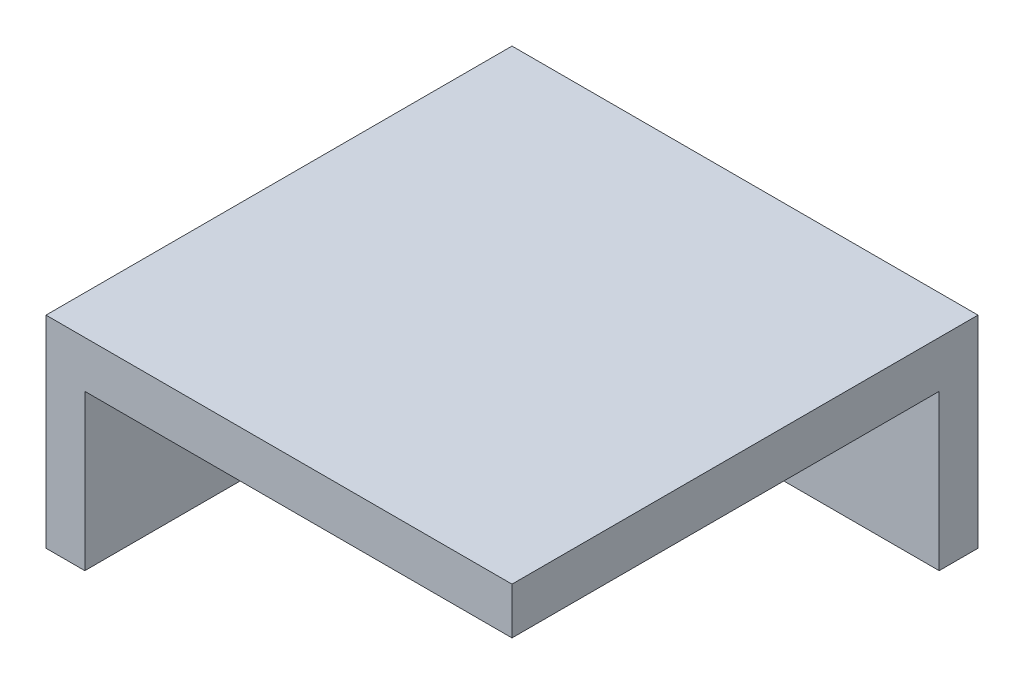
ISO-10303-21;
HEADER;
FILE_DESCRIPTION(('STEP AP214'),'2;1');
FILE_NAME('part.step','',(''),(''),'','','');
FILE_SCHEMA(('AUTOMOTIVE_DESIGN { 1 0 10303 214 1 1 1 1 }'));
ENDSEC;
DATA;
#1=APPLICATION_CONTEXT('core data for automotive mechanical design processes');
#2=APPLICATION_PROTOCOL_DEFINITION('international standard','automotive_design',2000,#1);
#3=PRODUCT_CONTEXT('',#1,'mechanical');
#4=PRODUCT('Part','Part','',(#3));
#5=PRODUCT_RELATED_PRODUCT_CATEGORY('part','',(#4));
#6=PRODUCT_DEFINITION_FORMATION('','',#4);
#7=PRODUCT_DEFINITION_CONTEXT('part definition',#1,'design');
#8=PRODUCT_DEFINITION('design','',#6,#7);
#9=PRODUCT_DEFINITION_SHAPE('','',#8);
#10=(LENGTH_UNIT() NAMED_UNIT(*) SI_UNIT(.MILLI.,.METRE.));
#11=(NAMED_UNIT(*) PLANE_ANGLE_UNIT() SI_UNIT($,.RADIAN.));
#12=(NAMED_UNIT(*) SI_UNIT($,.STERADIAN.) SOLID_ANGLE_UNIT());
#13=UNCERTAINTY_MEASURE_WITH_UNIT(LENGTH_MEASURE(1.E-05),#10,'distance_accuracy_value','');
#14=(GEOMETRIC_REPRESENTATION_CONTEXT(3) GLOBAL_UNCERTAINTY_ASSIGNED_CONTEXT((#13)) GLOBAL_UNIT_ASSIGNED_CONTEXT((#10,
#11,#12)) REPRESENTATION_CONTEXT('',''));
#15=CARTESIAN_POINT('',(0.,0.,0.));
#16=DIRECTION('',(0.,0.,1.));
#17=DIRECTION('',(1.,0.,0.));
#18=AXIS2_PLACEMENT_3D('',#15,#16,#17);
#19=CARTESIAN_POINT('',(30.,6.,30.));
#20=DIRECTION('',(-1.,0.,0.));
#21=DIRECTION('',(0.,0.,1.));
#22=AXIS2_PLACEMENT_3D('',#19,#20,#21);
#23=PLANE('',#22);
#24=DIRECTION('',(0.,0.,-1.));
#25=VECTOR('',#24,1.);
#26=CARTESIAN_POINT('',(30.,0.,30.));
#27=LINE('',#26,#25);
#28=CARTESIAN_POINT('',(30.,0.,30.));
#29=VERTEX_POINT('',#28);
#30=CARTESIAN_POINT('',(30.,0.,-25.));
#31=VERTEX_POINT('',#30);
#32=EDGE_CURVE('E111',#29,#31,#27,.T.);
#33=ORIENTED_EDGE('',*,*,#32,.T.);
#34=DIRECTION('',(0.,1.,0.));
#35=VECTOR('',#34,1.);
#36=CARTESIAN_POINT('',(30.,-20.,-25.));
#37=LINE('',#36,#35);
#38=CARTESIAN_POINT('',(30.,-20.,-25.));
#39=VERTEX_POINT('',#38);
#40=EDGE_CURVE('E47',#39,#31,#37,.T.);
#41=ORIENTED_EDGE('',*,*,#40,.F.);
#42=DIRECTION('',(0.,0.,-1.));
#43=VECTOR('',#42,1.);
#44=CARTESIAN_POINT('',(30.,-20.,-30.));
#45=LINE('',#44,#43);
#46=CARTESIAN_POINT('',(30.,-20.,-30.));
#47=VERTEX_POINT('',#46);
#48=EDGE_CURVE('E138',#39,#47,#45,.T.);
#49=ORIENTED_EDGE('',*,*,#48,.T.);
#50=DIRECTION('',(0.,-1.,0.));
#51=VECTOR('',#50,1.);
#52=CARTESIAN_POINT('',(30.,6.,-30.));
#53=LINE('',#52,#51);
#54=CARTESIAN_POINT('',(30.,6.,-30.));
#55=VERTEX_POINT('',#54);
#56=EDGE_CURVE('E11',#55,#47,#53,.T.);
#57=ORIENTED_EDGE('',*,*,#56,.F.);
#58=DIRECTION('',(0.,0.,-1.));
#59=VECTOR('',#58,1.);
#60=CARTESIAN_POINT('',(30.,6.,30.));
#61=LINE('',#60,#59);
#62=CARTESIAN_POINT('',(30.,6.,30.));
#63=VERTEX_POINT('',#62);
#64=EDGE_CURVE('E95',#63,#55,#61,.T.);
#65=ORIENTED_EDGE('',*,*,#64,.F.);
#66=DIRECTION('',(0.,-1.,0.));
#67=VECTOR('',#66,1.);
#68=CARTESIAN_POINT('',(30.,6.,30.));
#69=LINE('',#68,#67);
#70=EDGE_CURVE('E107',#63,#29,#69,.T.);
#71=ORIENTED_EDGE('',*,*,#70,.T.);
#72=EDGE_LOOP('',(#33,#41,#49,#57,#65,#71));
#73=FACE_BOUND('',#72,.T.);
#74=ADVANCED_FACE('F33',(#73),#23,.F.);
#75=CARTESIAN_POINT('',(30.,6.,-30.));
#76=DIRECTION('',(0.,0.,1.));
#77=DIRECTION('',(1.,0.,0.));
#78=AXIS2_PLACEMENT_3D('',#75,#76,#77);
#79=PLANE('',#78);
#80=ORIENTED_EDGE('',*,*,#56,.T.);
#81=DIRECTION('',(-1.,0.,0.));
#82=VECTOR('',#81,1.);
#83=CARTESIAN_POINT('',(-30.,-20.,-30.));
#84=LINE('',#83,#82);
#85=CARTESIAN_POINT('',(-30.,-20.,-30.));
#86=VERTEX_POINT('',#85);
#87=EDGE_CURVE('E99',#47,#86,#84,.T.);
#88=ORIENTED_EDGE('',*,*,#87,.T.);
#89=DIRECTION('',(0.,-1.,0.));
#90=VECTOR('',#89,1.);
#91=CARTESIAN_POINT('',(-30.,6.,-30.));
#92=LINE('',#91,#90);
#93=CARTESIAN_POINT('',(-30.,6.,-30.));
#94=VERTEX_POINT('',#93);
#95=EDGE_CURVE('E40',#94,#86,#92,.T.);
#96=ORIENTED_EDGE('',*,*,#95,.F.);
#97=DIRECTION('',(-1.,0.,0.));
#98=VECTOR('',#97,1.);
#99=CARTESIAN_POINT('',(30.,6.,-30.));
#100=LINE('',#99,#98);
#101=EDGE_CURVE('E88',#55,#94,#100,.T.);
#102=ORIENTED_EDGE('',*,*,#101,.F.);
#103=EDGE_LOOP('',(#80,#88,#96,#102));
#104=FACE_BOUND('',#103,.T.);
#105=ADVANCED_FACE('F98',(#104),#79,.F.);
#106=CARTESIAN_POINT('',(-30.,6.,-30.));
#107=DIRECTION('',(1.,0.,0.));
#108=DIRECTION('',(0.,0.,-1.));
#109=AXIS2_PLACEMENT_3D('',#106,#107,#108);
#110=PLANE('',#109);
#111=ORIENTED_EDGE('',*,*,#95,.T.);
#112=DIRECTION('',(0.,0.,1.));
#113=VECTOR('',#112,1.);
#114=CARTESIAN_POINT('',(-30.,-20.,-30.));
#115=LINE('',#114,#113);
#116=CARTESIAN_POINT('',(-30.,-20.,30.));
#117=VERTEX_POINT('',#116);
#118=EDGE_CURVE('E126',#86,#117,#115,.T.);
#119=ORIENTED_EDGE('',*,*,#118,.T.);
#120=DIRECTION('',(0.,-1.,0.));
#121=VECTOR('',#120,1.);
#122=CARTESIAN_POINT('',(-30.,6.,30.));
#123=LINE('',#122,#121);
#124=CARTESIAN_POINT('',(-30.,6.,30.));
#125=VERTEX_POINT('',#124);
#126=EDGE_CURVE('E103',#125,#117,#123,.T.);
#127=ORIENTED_EDGE('',*,*,#126,.F.);
#128=DIRECTION('',(0.,0.,1.));
#129=VECTOR('',#128,1.);
#130=CARTESIAN_POINT('',(-30.,6.,-30.));
#131=LINE('',#130,#129);
#132=EDGE_CURVE('E92',#94,#125,#131,.T.);
#133=ORIENTED_EDGE('',*,*,#132,.F.);
#134=EDGE_LOOP('',(#111,#119,#127,#133));
#135=FACE_BOUND('',#134,.T.);
#136=ADVANCED_FACE('F104',(#135),#110,.F.);
#137=CARTESIAN_POINT('',(-30.,6.,30.));
#138=DIRECTION('',(0.,0.,-1.));
#139=DIRECTION('',(-1.,0.,0.));
#140=AXIS2_PLACEMENT_3D('',#137,#138,#139);
#141=PLANE('',#140);
#142=ORIENTED_EDGE('',*,*,#126,.T.);
#143=DIRECTION('',(1.,0.,0.));
#144=VECTOR('',#143,1.);
#145=CARTESIAN_POINT('',(-30.,-20.,30.));
#146=LINE('',#145,#144);
#147=CARTESIAN_POINT('',(-25.,-20.,30.));
#148=VERTEX_POINT('',#147);
#149=EDGE_CURVE('E121',#117,#148,#146,.T.);
#150=ORIENTED_EDGE('',*,*,#149,.T.);
#151=DIRECTION('',(0.,1.,0.));
#152=VECTOR('',#151,1.);
#153=CARTESIAN_POINT('',(-25.,-20.,30.));
#154=LINE('',#153,#152);
#155=CARTESIAN_POINT('',(-25.,0.,30.));
#156=VERTEX_POINT('',#155);
#157=EDGE_CURVE('E141',#148,#156,#154,.T.);
#158=ORIENTED_EDGE('',*,*,#157,.T.);
#159=DIRECTION('',(1.,0.,0.));
#160=VECTOR('',#159,1.);
#161=CARTESIAN_POINT('',(-30.,0.,30.));
#162=LINE('',#161,#160);
#163=EDGE_CURVE('E68',#156,#29,#162,.T.);
#164=ORIENTED_EDGE('',*,*,#163,.T.);
#165=ORIENTED_EDGE('',*,*,#70,.F.);
#166=DIRECTION('',(1.,0.,0.));
#167=VECTOR('',#166,1.);
#168=CARTESIAN_POINT('',(-30.,6.,30.));
#169=LINE('',#168,#167);
#170=EDGE_CURVE('E56',#125,#63,#169,.T.);
#171=ORIENTED_EDGE('',*,*,#170,.F.);
#172=EDGE_LOOP('',(#142,#150,#158,#164,#165,#171));
#173=FACE_BOUND('',#172,.T.);
#174=ADVANCED_FACE('F119',(#173),#141,.F.);
#175=CARTESIAN_POINT('',(0.,6.,0.));
#176=DIRECTION('',(0.,1.,0.));
#177=DIRECTION('',(0.,0.,1.));
#178=AXIS2_PLACEMENT_3D('',#175,#176,#177);
#179=PLANE('',#178);
#180=ORIENTED_EDGE('',*,*,#64,.T.);
#181=ORIENTED_EDGE('',*,*,#101,.T.);
#182=ORIENTED_EDGE('',*,*,#132,.T.);
#183=ORIENTED_EDGE('',*,*,#170,.T.);
#184=EDGE_LOOP('',(#180,#181,#182,#183));
#185=FACE_BOUND('',#184,.T.);
#186=ADVANCED_FACE('F90',(#185),#179,.T.);
#187=CARTESIAN_POINT('',(0.,0.,0.));
#188=DIRECTION('',(0.,1.,0.));
#189=DIRECTION('',(0.,0.,1.));
#190=AXIS2_PLACEMENT_3D('',#187,#188,#189);
#191=PLANE('',#190);
#192=ORIENTED_EDGE('',*,*,#163,.F.);
#193=DIRECTION('',(0.,0.,-1.));
#194=VECTOR('',#193,1.);
#195=CARTESIAN_POINT('',(-25.,0.,-25.));
#196=LINE('',#195,#194);
#197=CARTESIAN_POINT('',(-25.,0.,-25.));
#198=VERTEX_POINT('',#197);
#199=EDGE_CURVE('E142',#156,#198,#196,.T.);
#200=ORIENTED_EDGE('',*,*,#199,.T.);
#201=DIRECTION('',(1.,0.,0.));
#202=VECTOR('',#201,1.);
#203=CARTESIAN_POINT('',(-25.,0.,-25.));
#204=LINE('',#203,#202);
#205=EDGE_CURVE('E132',#198,#31,#204,.T.);
#206=ORIENTED_EDGE('',*,*,#205,.T.);
#207=ORIENTED_EDGE('',*,*,#32,.F.);
#208=EDGE_LOOP('',(#192,#200,#206,#207));
#209=FACE_BOUND('',#208,.T.);
#210=ADVANCED_FACE('F156',(#209),#191,.F.);
#211=CARTESIAN_POINT('',(-25.,-20.,-25.));
#212=DIRECTION('',(0.,0.,1.));
#213=DIRECTION('',(1.,0.,0.));
#214=AXIS2_PLACEMENT_3D('',#211,#212,#213);
#215=PLANE('',#214);
#216=ORIENTED_EDGE('',*,*,#205,.F.);
#217=DIRECTION('',(0.,1.,0.));
#218=VECTOR('',#217,1.);
#219=CARTESIAN_POINT('',(-25.,-20.,-25.));
#220=LINE('',#219,#218);
#221=CARTESIAN_POINT('',(-25.,-20.,-25.));
#222=VERTEX_POINT('',#221);
#223=EDGE_CURVE('E147',#222,#198,#220,.T.);
#224=ORIENTED_EDGE('',*,*,#223,.F.);
#225=DIRECTION('',(1.,0.,0.));
#226=VECTOR('',#225,1.);
#227=CARTESIAN_POINT('',(-25.,-20.,-25.));
#228=LINE('',#227,#226);
#229=EDGE_CURVE('E136',#222,#39,#228,.T.);
#230=ORIENTED_EDGE('',*,*,#229,.T.);
#231=ORIENTED_EDGE('',*,*,#40,.T.);
#232=EDGE_LOOP('',(#216,#224,#230,#231));
#233=FACE_BOUND('',#232,.T.);
#234=ADVANCED_FACE('F159',(#233),#215,.T.);
#235=CARTESIAN_POINT('',(-25.,-20.,-25.));
#236=DIRECTION('',(1.,0.,0.));
#237=DIRECTION('',(0.,0.,-1.));
#238=AXIS2_PLACEMENT_3D('',#235,#236,#237);
#239=PLANE('',#238);
#240=ORIENTED_EDGE('',*,*,#199,.F.);
#241=ORIENTED_EDGE('',*,*,#157,.F.);
#242=DIRECTION('',(0.,0.,-1.));
#243=VECTOR('',#242,1.);
#244=CARTESIAN_POINT('',(-25.,-20.,-25.));
#245=LINE('',#244,#243);
#246=EDGE_CURVE('E129',#148,#222,#245,.T.);
#247=ORIENTED_EDGE('',*,*,#246,.T.);
#248=ORIENTED_EDGE('',*,*,#223,.T.);
#249=EDGE_LOOP('',(#240,#241,#247,#248));
#250=FACE_BOUND('',#249,.T.);
#251=ADVANCED_FACE('F152',(#250),#239,.T.);
#252=CARTESIAN_POINT('',(0.,-20.,0.));
#253=DIRECTION('',(0.,-1.,0.));
#254=DIRECTION('',(0.,0.,-1.));
#255=AXIS2_PLACEMENT_3D('',#252,#253,#254);
#256=PLANE('',#255);
#257=ORIENTED_EDGE('',*,*,#87,.F.);
#258=ORIENTED_EDGE('',*,*,#48,.F.);
#259=ORIENTED_EDGE('',*,*,#229,.F.);
#260=ORIENTED_EDGE('',*,*,#246,.F.);
#261=ORIENTED_EDGE('',*,*,#149,.F.);
#262=ORIENTED_EDGE('',*,*,#118,.F.);
#263=EDGE_LOOP('',(#257,#258,#259,#260,#261,#262));
#264=FACE_BOUND('',#263,.T.);
#265=ADVANCED_FACE('F125',(#264),#256,.T.);
#266=CLOSED_SHELL('',(#74,#105,#136,#174,#186,#210,#234,#251,#265));
#267=MANIFOLD_SOLID_BREP('B2',#266);
#268=ADVANCED_BREP_SHAPE_REPRESENTATION('',(#18,#267),#14);
#269=SHAPE_DEFINITION_REPRESENTATION(#9,#268);
ENDSEC;
END-ISO-10303-21;
